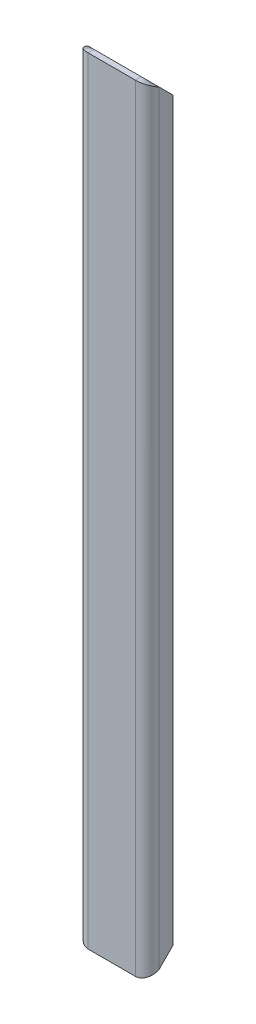
ISO-10303-21;
HEADER;
FILE_DESCRIPTION(('STEP AP214'),'2;1');
FILE_NAME('part.step','',(''),(''),'','','');
FILE_SCHEMA(('AUTOMOTIVE_DESIGN { 1 0 10303 214 1 1 1 1 }'));
ENDSEC;
DATA;
#1=APPLICATION_CONTEXT('core data for automotive mechanical design processes');
#2=APPLICATION_PROTOCOL_DEFINITION('international standard','automotive_design',2000,#1);
#3=PRODUCT_CONTEXT('',#1,'mechanical');
#4=PRODUCT('Part','Part','',(#3));
#5=PRODUCT_RELATED_PRODUCT_CATEGORY('part','',(#4));
#6=PRODUCT_DEFINITION_FORMATION('','',#4);
#7=PRODUCT_DEFINITION_CONTEXT('part definition',#1,'design');
#8=PRODUCT_DEFINITION('design','',#6,#7);
#9=PRODUCT_DEFINITION_SHAPE('','',#8);
#10=(LENGTH_UNIT() NAMED_UNIT(*) SI_UNIT(.MILLI.,.METRE.));
#11=(NAMED_UNIT(*) PLANE_ANGLE_UNIT() SI_UNIT($,.RADIAN.));
#12=(NAMED_UNIT(*) SI_UNIT($,.STERADIAN.) SOLID_ANGLE_UNIT());
#13=UNCERTAINTY_MEASURE_WITH_UNIT(LENGTH_MEASURE(1.E-05),#10,'distance_accuracy_value','');
#14=(GEOMETRIC_REPRESENTATION_CONTEXT(3) GLOBAL_UNCERTAINTY_ASSIGNED_CONTEXT((#13)) GLOBAL_UNIT_ASSIGNED_CONTEXT((#10,
#11,#12)) REPRESENTATION_CONTEXT('',''));
#15=CARTESIAN_POINT('',(0.,0.,0.));
#16=DIRECTION('',(0.,0.,1.));
#17=DIRECTION('',(1.,0.,0.));
#18=AXIS2_PLACEMENT_3D('',#15,#16,#17);
#19=CARTESIAN_POINT('',(18.,400.,0.));
#20=DIRECTION('',(-1.,0.,0.));
#21=DIRECTION('',(0.,0.,1.));
#22=AXIS2_PLACEMENT_3D('',#19,#20,#21);
#23=PLANE('',#22);
#24=DIRECTION('',(0.,-0.707106781186544,-0.707106781186551));
#25=VECTOR('',#24,1.);
#26=CARTESIAN_POINT('',(18.,400.,2.99999999999999));
#27=LINE('',#26,#25);
#28=CARTESIAN_POINT('',(18.,394.,-3.00000000000001));
#29=VERTEX_POINT('',#28);
#30=CARTESIAN_POINT('',(18.,387.,-10.));
#31=VERTEX_POINT('',#30);
#32=EDGE_CURVE('E246',#29,#31,#27,.T.);
#33=ORIENTED_EDGE('',*,*,#32,.F.);
#34=DIRECTION('',(0.,-1.,0.));
#35=VECTOR('',#34,1.);
#36=CARTESIAN_POINT('',(18.,400.,-3.00000000000001));
#37=LINE('',#36,#35);
#38=CARTESIAN_POINT('',(18.,5.99999999999989,-3.00000000000001));
#39=VERTEX_POINT('',#38);
#40=EDGE_CURVE('E61',#29,#39,#37,.T.);
#41=ORIENTED_EDGE('',*,*,#40,.T.);
#42=DIRECTION('',(0.,0.707106781186544,-0.707106781186551));
#43=VECTOR('',#42,1.);
#44=CARTESIAN_POINT('',(18.,201.499999999998,-198.5));
#45=LINE('',#44,#43);
#46=CARTESIAN_POINT('',(18.,12.9999999999998,-9.99999999999998));
#47=VERTEX_POINT('',#46);
#48=EDGE_CURVE('E198',#39,#47,#45,.T.);
#49=ORIENTED_EDGE('',*,*,#48,.T.);
#50=DIRECTION('',(0.,-1.,0.));
#51=VECTOR('',#50,1.);
#52=CARTESIAN_POINT('',(18.,400.,-10.));
#53=LINE('',#52,#51);
#54=EDGE_CURVE('E11',#31,#47,#53,.T.);
#55=ORIENTED_EDGE('',*,*,#54,.F.);
#56=EDGE_LOOP('',(#33,#41,#49,#55));
#57=FACE_BOUND('',#56,.T.);
#58=ADVANCED_FACE('F39',(#57),#23,.F.);
#59=CARTESIAN_POINT('',(15.,400.,-10.));
#60=DIRECTION('',(0.,0.,-1.));
#61=DIRECTION('',(-1.,0.,0.));
#62=AXIS2_PLACEMENT_3D('',#59,#60,#61);
#63=PLANE('',#62);
#64=DIRECTION('',(0.,-1.,0.));
#65=VECTOR('',#64,1.);
#66=CARTESIAN_POINT('',(15.,400.,-10.));
#67=LINE('',#66,#65);
#68=CARTESIAN_POINT('',(15.,387.,-10.));
#69=VERTEX_POINT('',#68);
#70=CARTESIAN_POINT('',(15.,12.9999999999998,-9.99999999999998));
#71=VERTEX_POINT('',#70);
#72=EDGE_CURVE('E46',#69,#71,#67,.T.);
#73=ORIENTED_EDGE('',*,*,#72,.F.);
#74=DIRECTION('',(1.,0.,0.));
#75=VECTOR('',#74,1.);
#76=CARTESIAN_POINT('',(18.,387.,-10.));
#77=LINE('',#76,#75);
#78=EDGE_CURVE('E249',#31,#69,#77,.F.);
#79=ORIENTED_EDGE('',*,*,#78,.F.);
#80=ORIENTED_EDGE('',*,*,#54,.T.);
#81=DIRECTION('',(-1.,0.,0.));
#82=VECTOR('',#81,1.);
#83=CARTESIAN_POINT('',(15.,12.9999999999998,-9.99999999999998));
#84=LINE('',#83,#82);
#85=EDGE_CURVE('E196',#71,#47,#84,.F.);
#86=ORIENTED_EDGE('',*,*,#85,.F.);
#87=EDGE_LOOP('',(#73,#79,#80,#86));
#88=FACE_BOUND('',#87,.T.);
#89=ADVANCED_FACE('F201',(#88),#63,.T.);
#90=CARTESIAN_POINT('',(15.,400.,0.));
#91=DIRECTION('',(-1.,0.,0.));
#92=DIRECTION('',(0.,0.,1.));
#93=AXIS2_PLACEMENT_3D('',#90,#91,#92);
#94=PLANE('',#93);
#95=DIRECTION('',(0.,-1.,0.));
#96=VECTOR('',#95,1.);
#97=CARTESIAN_POINT('',(15.,400.,-3.00000000000001));
#98=LINE('',#97,#96);
#99=CARTESIAN_POINT('',(15.,394.,-3.00000000000001));
#100=VERTEX_POINT('',#99);
#101=CARTESIAN_POINT('',(15.,5.99999999999989,-3.00000000000001));
#102=VERTEX_POINT('',#101);
#103=EDGE_CURVE('E178',#100,#102,#98,.T.);
#104=ORIENTED_EDGE('',*,*,#103,.F.);
#105=DIRECTION('',(0.,-0.707106781186544,-0.707106781186551));
#106=VECTOR('',#105,1.);
#107=CARTESIAN_POINT('',(15.,400.,2.99999999999999));
#108=LINE('',#107,#106);
#109=EDGE_CURVE('E187',#100,#69,#108,.T.);
#110=ORIENTED_EDGE('',*,*,#109,.T.);
#111=ORIENTED_EDGE('',*,*,#72,.T.);
#112=DIRECTION('',(0.,0.707106781186544,-0.707106781186551));
#113=VECTOR('',#112,1.);
#114=CARTESIAN_POINT('',(15.,201.499999999998,-198.5));
#115=LINE('',#114,#113);
#116=EDGE_CURVE('E186',#102,#71,#115,.T.);
#117=ORIENTED_EDGE('',*,*,#116,.F.);
#118=EDGE_LOOP('',(#104,#110,#111,#117));
#119=FACE_BOUND('',#118,.T.);
#120=ADVANCED_FACE('F185',(#119),#94,.T.);
#121=CARTESIAN_POINT('',(12.,400.,-3.00000000000001));
#122=DIRECTION('',(0.,-1.,0.));
#123=DIRECTION('',(0.,0.,-1.));
#124=AXIS2_PLACEMENT_3D('',#121,#122,#123);
#125=CYLINDRICAL_SURFACE('',#124,3.);
#126=DIRECTION('',(0.,-1.,0.));
#127=VECTOR('',#126,1.);
#128=CARTESIAN_POINT('',(12.,400.,0.));
#129=LINE('',#128,#127);
#130=CARTESIAN_POINT('',(12.,397.,0.));
#131=VERTEX_POINT('',#130);
#132=CARTESIAN_POINT('',(12.,2.9999999999999,0.));
#133=VERTEX_POINT('',#132);
#134=EDGE_CURVE('E176',#131,#133,#129,.T.);
#135=ORIENTED_EDGE('',*,*,#134,.F.);
#136=CARTESIAN_POINT('',(12.,394.,-3.00000000000001));
#137=DIRECTION('',(0.,-0.707106781186551,0.707106781186544));
#138=DIRECTION('',(0.,-0.707106781186544,-0.707106781186551));
#139=AXIS2_PLACEMENT_3D('',#136,#137,#138);
#140=ELLIPSE('',#139,4.24264068711926,3.);
#141=EDGE_CURVE('E157',#100,#131,#140,.T.);
#142=ORIENTED_EDGE('',*,*,#141,.F.);
#143=ORIENTED_EDGE('',*,*,#103,.T.);
#144=CARTESIAN_POINT('',(12.,5.99999999999989,-3.00000000000001));
#145=DIRECTION('',(0.,0.707106781186551,0.707106781186544));
#146=DIRECTION('',(0.,-0.707106781186544,0.707106781186551));
#147=AXIS2_PLACEMENT_3D('',#144,#145,#146);
#148=ELLIPSE('',#147,4.24264068711926,3.);
#149=EDGE_CURVE('E225',#133,#102,#148,.T.);
#150=ORIENTED_EDGE('',*,*,#149,.F.);
#151=EDGE_LOOP('',(#135,#142,#143,#150));
#152=FACE_BOUND('',#151,.T.);
#153=ADVANCED_FACE('F292',(#152),#125,.F.);
#154=CARTESIAN_POINT('',(-15.,400.,0.));
#155=DIRECTION('',(0.,0.,-1.));
#156=DIRECTION('',(-1.,0.,0.));
#157=AXIS2_PLACEMENT_3D('',#154,#155,#156);
#158=PLANE('',#157);
#159=DIRECTION('',(0.,-1.,0.));
#160=VECTOR('',#159,1.);
#161=CARTESIAN_POINT('',(-12.,400.,0.));
#162=LINE('',#161,#160);
#163=CARTESIAN_POINT('',(-12.,397.,0.));
#164=VERTEX_POINT('',#163);
#165=CARTESIAN_POINT('',(-12.,3.,0.));
#166=VERTEX_POINT('',#165);
#167=EDGE_CURVE('E174',#164,#166,#162,.T.);
#168=ORIENTED_EDGE('',*,*,#167,.F.);
#169=DIRECTION('',(-1.,0.,0.));
#170=VECTOR('',#169,1.);
#171=CARTESIAN_POINT('',(-15.,397.,0.));
#172=LINE('',#171,#170);
#173=EDGE_CURVE('E289',#131,#164,#172,.T.);
#174=ORIENTED_EDGE('',*,*,#173,.F.);
#175=ORIENTED_EDGE('',*,*,#134,.T.);
#176=DIRECTION('',(1.,0.,0.));
#177=VECTOR('',#176,1.);
#178=CARTESIAN_POINT('',(-14.9999999999999,2.99999999999989,0.));
#179=LINE('',#178,#177);
#180=EDGE_CURVE('E235',#166,#133,#179,.T.);
#181=ORIENTED_EDGE('',*,*,#180,.F.);
#182=EDGE_LOOP('',(#168,#174,#175,#181));
#183=FACE_BOUND('',#182,.T.);
#184=ADVANCED_FACE('F285',(#183),#158,.T.);
#185=CARTESIAN_POINT('',(-12.,400.,-3.));
#186=DIRECTION('',(0.,-1.,0.));
#187=DIRECTION('',(0.,0.,-1.));
#188=AXIS2_PLACEMENT_3D('',#185,#186,#187);
#189=CYLINDRICAL_SURFACE('',#188,3.);
#190=DIRECTION('',(0.,-1.,0.));
#191=VECTOR('',#190,1.);
#192=CARTESIAN_POINT('',(-15.,400.,-3.));
#193=LINE('',#192,#191);
#194=CARTESIAN_POINT('',(-15.,394.,-3.));
#195=VERTEX_POINT('',#194);
#196=CARTESIAN_POINT('',(-15.,5.99999999999989,-3.));
#197=VERTEX_POINT('',#196);
#198=EDGE_CURVE('E172',#195,#197,#193,.T.);
#199=ORIENTED_EDGE('',*,*,#198,.F.);
#200=CARTESIAN_POINT('',(-12.,394.,-3.));
#201=DIRECTION('',(0.,-0.707106781186551,0.707106781186544));
#202=DIRECTION('',(0.,-0.707106781186544,-0.707106781186551));
#203=AXIS2_PLACEMENT_3D('',#200,#201,#202);
#204=ELLIPSE('',#203,4.24264068711926,3.);
#205=EDGE_CURVE('E135',#164,#195,#204,.T.);
#206=ORIENTED_EDGE('',*,*,#205,.F.);
#207=ORIENTED_EDGE('',*,*,#167,.T.);
#208=CARTESIAN_POINT('',(-12.,5.99999999999989,-3.));
#209=DIRECTION('',(0.,0.707106781186551,0.707106781186544));
#210=DIRECTION('',(0.,-0.707106781186544,0.707106781186551));
#211=AXIS2_PLACEMENT_3D('',#208,#209,#210);
#212=ELLIPSE('',#211,4.24264068711926,3.);
#213=EDGE_CURVE('E224',#197,#166,#212,.T.);
#214=ORIENTED_EDGE('',*,*,#213,.F.);
#215=EDGE_LOOP('',(#199,#206,#207,#214));
#216=FACE_BOUND('',#215,.T.);
#217=ADVANCED_FACE('F280',(#216),#189,.F.);
#218=CARTESIAN_POINT('',(-15.,400.,0.));
#219=DIRECTION('',(1.,0.,0.));
#220=DIRECTION('',(0.,0.,-1.));
#221=AXIS2_PLACEMENT_3D('',#218,#219,#220);
#222=PLANE('',#221);
#223=DIRECTION('',(0.,-1.,0.));
#224=VECTOR('',#223,1.);
#225=CARTESIAN_POINT('',(-15.,400.,-20.));
#226=LINE('',#225,#224);
#227=CARTESIAN_POINT('',(-15.,377.,-20.));
#228=VERTEX_POINT('',#227);
#229=CARTESIAN_POINT('',(-15.,22.9999999999997,-20.));
#230=VERTEX_POINT('',#229);
#231=EDGE_CURVE('E165',#228,#230,#226,.T.);
#232=ORIENTED_EDGE('',*,*,#231,.F.);
#233=DIRECTION('',(0.,-0.707106781186544,-0.707106781186551));
#234=VECTOR('',#233,1.);
#235=CARTESIAN_POINT('',(-15.,400.,2.99999999999999));
#236=LINE('',#235,#234);
#237=EDGE_CURVE('E139',#195,#228,#236,.T.);
#238=ORIENTED_EDGE('',*,*,#237,.F.);
#239=ORIENTED_EDGE('',*,*,#198,.T.);
#240=DIRECTION('',(0.,-0.707106781186544,0.707106781186551));
#241=VECTOR('',#240,1.);
#242=CARTESIAN_POINT('',(-15.0000000000001,201.499999999998,-198.5));
#243=LINE('',#242,#241);
#244=EDGE_CURVE('E260',#230,#197,#243,.T.);
#245=ORIENTED_EDGE('',*,*,#244,.F.);
#246=EDGE_LOOP('',(#232,#238,#239,#245));
#247=FACE_BOUND('',#246,.T.);
#248=ADVANCED_FACE('F276',(#247),#222,.T.);
#249=CARTESIAN_POINT('',(-18.,400.,-20.));
#250=DIRECTION('',(0.,0.,-1.));
#251=DIRECTION('',(-1.,0.,0.));
#252=AXIS2_PLACEMENT_3D('',#249,#250,#251);
#253=PLANE('',#252);
#254=DIRECTION('',(0.,-1.,0.));
#255=VECTOR('',#254,1.);
#256=CARTESIAN_POINT('',(-18.,400.,-20.));
#257=LINE('',#256,#255);
#258=CARTESIAN_POINT('',(-18.,377.,-20.));
#259=VERTEX_POINT('',#258);
#260=CARTESIAN_POINT('',(-18.,22.9999999999997,-20.));
#261=VERTEX_POINT('',#260);
#262=EDGE_CURVE('E163',#259,#261,#257,.T.);
#263=ORIENTED_EDGE('',*,*,#262,.F.);
#264=DIRECTION('',(-1.,0.,0.));
#265=VECTOR('',#264,1.);
#266=CARTESIAN_POINT('',(-18.,377.,-20.));
#267=LINE('',#266,#265);
#268=EDGE_CURVE('E138',#259,#228,#267,.F.);
#269=ORIENTED_EDGE('',*,*,#268,.T.);
#270=ORIENTED_EDGE('',*,*,#231,.T.);
#271=DIRECTION('',(1.,0.,0.));
#272=VECTOR('',#271,1.);
#273=CARTESIAN_POINT('',(-15.,22.9999999999997,-20.));
#274=LINE('',#273,#272);
#275=EDGE_CURVE('E244',#230,#261,#274,.F.);
#276=ORIENTED_EDGE('',*,*,#275,.T.);
#277=EDGE_LOOP('',(#263,#269,#270,#276));
#278=FACE_BOUND('',#277,.T.);
#279=ADVANCED_FACE('F271',(#278),#253,.T.);
#280=CARTESIAN_POINT('',(-18.,400.,0.));
#281=DIRECTION('',(1.,0.,0.));
#282=DIRECTION('',(0.,0.,-1.));
#283=AXIS2_PLACEMENT_3D('',#280,#281,#282);
#284=PLANE('',#283);
#285=DIRECTION('',(0.,-0.707106781186544,-0.707106781186551));
#286=VECTOR('',#285,1.);
#287=CARTESIAN_POINT('',(-18.,400.,2.99999999999999));
#288=LINE('',#287,#286);
#289=CARTESIAN_POINT('',(-18.,394.,-3.));
#290=VERTEX_POINT('',#289);
#291=EDGE_CURVE('E142',#290,#259,#288,.T.);
#292=ORIENTED_EDGE('',*,*,#291,.T.);
#293=ORIENTED_EDGE('',*,*,#262,.T.);
#294=DIRECTION('',(0.,-0.707106781186544,0.707106781186551));
#295=VECTOR('',#294,1.);
#296=CARTESIAN_POINT('',(-18.0000000000001,201.499999999998,-198.5));
#297=LINE('',#296,#295);
#298=CARTESIAN_POINT('',(-18.,5.99999999999989,-3.));
#299=VERTEX_POINT('',#298);
#300=EDGE_CURVE('E162',#261,#299,#297,.T.);
#301=ORIENTED_EDGE('',*,*,#300,.T.);
#302=DIRECTION('',(0.,-1.,0.));
#303=VECTOR('',#302,1.);
#304=CARTESIAN_POINT('',(-18.,400.,-3.));
#305=LINE('',#304,#303);
#306=EDGE_CURVE('E154',#290,#299,#305,.T.);
#307=ORIENTED_EDGE('',*,*,#306,.F.);
#308=EDGE_LOOP('',(#292,#293,#301,#307));
#309=FACE_BOUND('',#308,.T.);
#310=ADVANCED_FACE('F160',(#309),#284,.F.);
#311=CARTESIAN_POINT('',(-12.,400.,-3.));
#312=DIRECTION('',(0.,-1.,0.));
#313=DIRECTION('',(0.,0.,-1.));
#314=AXIS2_PLACEMENT_3D('',#311,#312,#313);
#315=CYLINDRICAL_SURFACE('',#314,6.);
#316=CARTESIAN_POINT('',(-12.,394.,-3.));
#317=DIRECTION('',(0.,-0.894427190999919,0.447213595499952));
#318=DIRECTION('',(0.,-0.447213595499952,-0.894427190999919));
#319=AXIS2_PLACEMENT_3D('',#316,#317,#318);
#320=ELLIPSE('',#319,6.70820393249935,6.);
#321=CARTESIAN_POINT('',(-12.,397.,3.));
#322=VERTEX_POINT('',#321);
#323=EDGE_CURVE('E132',#322,#290,#320,.T.);
#324=ORIENTED_EDGE('',*,*,#323,.T.);
#325=ORIENTED_EDGE('',*,*,#306,.T.);
#326=CARTESIAN_POINT('',(-12.,5.99999999999989,-3.));
#327=DIRECTION('',(0.,0.894427190999917,0.447213595499956));
#328=DIRECTION('',(0.,-0.447213595499956,0.894427190999917));
#329=AXIS2_PLACEMENT_3D('',#326,#327,#328);
#330=ELLIPSE('',#329,6.70820393249936,6.);
#331=CARTESIAN_POINT('',(-12.,3.00000000000011,3.));
#332=VERTEX_POINT('',#331);
#333=EDGE_CURVE('E258',#299,#332,#330,.T.);
#334=ORIENTED_EDGE('',*,*,#333,.T.);
#335=DIRECTION('',(0.,-1.,0.));
#336=VECTOR('',#335,1.);
#337=CARTESIAN_POINT('',(-12.,400.,3.));
#338=LINE('',#337,#336);
#339=EDGE_CURVE('E156',#322,#332,#338,.T.);
#340=ORIENTED_EDGE('',*,*,#339,.F.);
#341=EDGE_LOOP('',(#324,#325,#334,#340));
#342=FACE_BOUND('',#341,.T.);
#343=ADVANCED_FACE('F152',(#342),#315,.T.);
#344=CARTESIAN_POINT('',(-15.,400.,3.));
#345=DIRECTION('',(0.,0.,-1.));
#346=DIRECTION('',(-1.,0.,0.));
#347=AXIS2_PLACEMENT_3D('',#344,#345,#346);
#348=PLANE('',#347);
#349=DIRECTION('',(-1.,0.,0.));
#350=VECTOR('',#349,1.);
#351=CARTESIAN_POINT('',(-15.,397.,3.));
#352=LINE('',#351,#350);
#353=CARTESIAN_POINT('',(12.,397.,2.99999999999999));
#354=VERTEX_POINT('',#353);
#355=EDGE_CURVE('E297',#354,#322,#352,.T.);
#356=ORIENTED_EDGE('',*,*,#355,.T.);
#357=ORIENTED_EDGE('',*,*,#339,.T.);
#358=DIRECTION('',(-1.,0.,0.));
#359=VECTOR('',#358,1.);
#360=CARTESIAN_POINT('',(-15.,3.00000000000011,3.));
#361=LINE('',#360,#359);
#362=CARTESIAN_POINT('',(12.,2.99999999999989,2.99999999999999));
#363=VERTEX_POINT('',#362);
#364=EDGE_CURVE('E232',#332,#363,#361,.F.);
#365=ORIENTED_EDGE('',*,*,#364,.T.);
#366=DIRECTION('',(0.,-1.,0.));
#367=VECTOR('',#366,1.);
#368=CARTESIAN_POINT('',(12.,400.,2.99999999999999));
#369=LINE('',#368,#367);
#370=EDGE_CURVE('E167',#354,#363,#369,.T.);
#371=ORIENTED_EDGE('',*,*,#370,.F.);
#372=EDGE_LOOP('',(#356,#357,#365,#371));
#373=FACE_BOUND('',#372,.T.);
#374=ADVANCED_FACE('F238',(#373),#348,.F.);
#375=CARTESIAN_POINT('',(12.,400.,-3.00000000000001));
#376=DIRECTION('',(0.,-1.,0.));
#377=DIRECTION('',(0.,0.,-1.));
#378=AXIS2_PLACEMENT_3D('',#375,#376,#377);
#379=CYLINDRICAL_SURFACE('',#378,6.);
#380=CARTESIAN_POINT('',(12.,394.,-3.00000000000001));
#381=DIRECTION('',(0.,-0.894427190999919,0.447213595499952));
#382=DIRECTION('',(0.,-0.447213595499952,-0.894427190999919));
#383=AXIS2_PLACEMENT_3D('',#380,#381,#382);
#384=ELLIPSE('',#383,6.70820393249935,6.);
#385=EDGE_CURVE('E214',#29,#354,#384,.T.);
#386=ORIENTED_EDGE('',*,*,#385,.T.);
#387=ORIENTED_EDGE('',*,*,#370,.T.);
#388=CARTESIAN_POINT('',(12.,5.99999999999989,-3.00000000000001));
#389=DIRECTION('',(0.,0.894427190999917,0.447213595499956));
#390=DIRECTION('',(0.,-0.447213595499956,0.894427190999917));
#391=AXIS2_PLACEMENT_3D('',#388,#389,#390);
#392=ELLIPSE('',#391,6.70820393249936,6.);
#393=EDGE_CURVE('E213',#363,#39,#392,.T.);
#394=ORIENTED_EDGE('',*,*,#393,.T.);
#395=ORIENTED_EDGE('',*,*,#40,.F.);
#396=EDGE_LOOP('',(#386,#387,#394,#395));
#397=FACE_BOUND('',#396,.T.);
#398=ADVANCED_FACE('F212',(#397),#379,.T.);
#399=CARTESIAN_POINT('',(15.,201.499999999998,-198.5));
#400=DIRECTION('',(0.,0.707106781186551,0.707106781186544));
#401=DIRECTION('',(0.,0.707106781186544,-0.707106781186551));
#402=AXIS2_PLACEMENT_3D('',#399,#400,#401);
#403=PLANE('',#402);
#404=ORIENTED_EDGE('',*,*,#116,.T.);
#405=ORIENTED_EDGE('',*,*,#85,.T.);
#406=ORIENTED_EDGE('',*,*,#48,.F.);
#407=DIRECTION('',(-1.,0.,0.));
#408=VECTOR('',#407,1.);
#409=CARTESIAN_POINT('',(15.,5.99999999999989,-3.00000000000001));
#410=LINE('',#409,#408);
#411=EDGE_CURVE('E197',#102,#39,#410,.F.);
#412=ORIENTED_EDGE('',*,*,#411,.F.);
#413=EDGE_LOOP('',(#404,#405,#406,#412));
#414=FACE_BOUND('',#413,.T.);
#415=ADVANCED_FACE('F194',(#414),#403,.F.);
#416=CARTESIAN_POINT('',(-14.9999999999999,2.99999999999989,0.));
#417=DIRECTION('',(0.,1.,0.));
#418=DIRECTION('',(1.,0.,0.));
#419=AXIS2_PLACEMENT_3D('',#416,#417,#418);
#420=PLANE('',#419);
#421=ORIENTED_EDGE('',*,*,#180,.T.);
#422=DIRECTION('',(0.,0.,-1.));
#423=VECTOR('',#422,1.);
#424=CARTESIAN_POINT('',(12.,2.9999999999999,0.));
#425=LINE('',#424,#423);
#426=EDGE_CURVE('E199',#133,#363,#425,.F.);
#427=ORIENTED_EDGE('',*,*,#426,.T.);
#428=ORIENTED_EDGE('',*,*,#364,.F.);
#429=DIRECTION('',(0.,0.,-1.));
#430=VECTOR('',#429,1.);
#431=CARTESIAN_POINT('',(-12.,3.,0.));
#432=LINE('',#431,#430);
#433=EDGE_CURVE('E236',#166,#332,#432,.F.);
#434=ORIENTED_EDGE('',*,*,#433,.F.);
#435=EDGE_LOOP('',(#421,#427,#428,#434));
#436=FACE_BOUND('',#435,.T.);
#437=ADVANCED_FACE('F230',(#436),#420,.F.);
#438=CARTESIAN_POINT('',(-15.0000000000001,201.499999999998,-198.5));
#439=DIRECTION('',(0.,0.707106781186551,0.707106781186544));
#440=DIRECTION('',(0.,-0.707106781186544,0.707106781186551));
#441=AXIS2_PLACEMENT_3D('',#438,#439,#440);
#442=PLANE('',#441);
#443=ORIENTED_EDGE('',*,*,#244,.T.);
#444=DIRECTION('',(1.,0.,0.));
#445=VECTOR('',#444,1.);
#446=CARTESIAN_POINT('',(-15.,5.99999999999989,-3.));
#447=LINE('',#446,#445);
#448=EDGE_CURVE('E241',#197,#299,#447,.F.);
#449=ORIENTED_EDGE('',*,*,#448,.T.);
#450=ORIENTED_EDGE('',*,*,#300,.F.);
#451=ORIENTED_EDGE('',*,*,#275,.F.);
#452=EDGE_LOOP('',(#443,#449,#450,#451));
#453=FACE_BOUND('',#452,.T.);
#454=ADVANCED_FACE('F274',(#453),#442,.F.);
#455=CARTESIAN_POINT('',(-12.,2.99999999999993,0.));
#456=CARTESIAN_POINT('',(-12.,2.99999999999992,1.));
#457=CARTESIAN_POINT('',(-12.,2.99999999999992,2.));
#458=CARTESIAN_POINT('',(-12.,2.99999999999991,3.));
#459=CARTESIAN_POINT('',(-6.,2.99999999999993,0.));
#460=CARTESIAN_POINT('',(-4.,2.99999999999992,1.));
#461=CARTESIAN_POINT('',(-2.,2.99999999999992,2.));
#462=CARTESIAN_POINT('',(0.,2.99999999999991,3.));
#463=CARTESIAN_POINT('',(-6.,8.99999999999986,-6.));
#464=CARTESIAN_POINT('',(-4.,8.99999999999987,-7.));
#465=CARTESIAN_POINT('',(-2.,8.99999999999988,-8.));
#466=CARTESIAN_POINT('',(0.,8.99999999999988,-9.));
#467=CARTESIAN_POINT('',(-12.,8.99999999999986,-6.));
#468=CARTESIAN_POINT('',(-12.,8.99999999999987,-7.));
#469=CARTESIAN_POINT('',(-12.,8.99999999999987,-8.));
#470=CARTESIAN_POINT('',(-12.,8.99999999999988,-9.));
#471=CARTESIAN_POINT('',(-18.,8.99999999999986,-6.));
#472=CARTESIAN_POINT('',(-20.,8.99999999999987,-7.));
#473=CARTESIAN_POINT('',(-22.,8.99999999999988,-8.00000000000001));
#474=CARTESIAN_POINT('',(-24.,8.99999999999988,-9.));
#475=CARTESIAN_POINT('',(-18.,2.99999999999993,0.));
#476=CARTESIAN_POINT('',(-20.,2.99999999999992,1.));
#477=CARTESIAN_POINT('',(-22.,2.99999999999992,2.));
#478=CARTESIAN_POINT('',(-24.,2.99999999999991,3.));
#479=CARTESIAN_POINT('',(-12.,2.99999999999993,0.));
#480=CARTESIAN_POINT('',(-12.,2.99999999999992,1.));
#481=CARTESIAN_POINT('',(-12.,2.99999999999992,2.));
#482=CARTESIAN_POINT('',(-12.,2.99999999999991,3.));
#483=(BOUNDED_SURFACE() B_SPLINE_SURFACE(3,3,((#455,#456,#457,#458),(#459,#460,#461,#462),(#463,
#464,#465,#466),(#467,#468,#469,#470),(#471,#472,#473,#474),(#475,#476,#477,#478),(#479,#480,
#481,#482)),.UNSPECIFIED.,.T.,.F.,.F.) B_SPLINE_SURFACE_WITH_KNOTS((4,3,4),(4,4),(0.,0.5,1.),
(0.,1.),.UNSPECIFIED.) GEOMETRIC_REPRESENTATION_ITEM() RATIONAL_B_SPLINE_SURFACE(((1.,1.,1.,1.),
(0.333333333333333,0.333333333333333,0.333333333333333,0.333333333333333),(0.333333333333333,
0.333333333333333,0.333333333333333,0.333333333333333),(1.,1.,1.,1.),(0.333333333333333,
0.333333333333333,0.333333333333333,0.333333333333333),(0.333333333333333,0.333333333333333,
0.333333333333333,0.333333333333333),(1.,1.,1.,1.))) REPRESENTATION_ITEM('') SURFACE());
#484=ORIENTED_EDGE('',*,*,#213,.T.);
#485=ORIENTED_EDGE('',*,*,#433,.T.);
#486=ORIENTED_EDGE('',*,*,#333,.F.);
#487=ORIENTED_EDGE('',*,*,#448,.F.);
#488=EDGE_LOOP('',(#484,#485,#486,#487));
#489=FACE_BOUND('',#488,.T.);
#490=ADVANCED_FACE('F283',(#489),#483,.T.);
#491=CARTESIAN_POINT('',(12.,2.99999999999993,0.));
#492=CARTESIAN_POINT('',(12.,2.99999999999992,0.999999999999995));
#493=CARTESIAN_POINT('',(12.,2.99999999999992,1.99999999999999));
#494=CARTESIAN_POINT('',(12.,2.99999999999991,2.99999999999999));
#495=CARTESIAN_POINT('',(18.,2.99999999999993,0.));
#496=CARTESIAN_POINT('',(20.,2.99999999999992,0.999999999999995));
#497=CARTESIAN_POINT('',(22.,2.99999999999992,2.));
#498=CARTESIAN_POINT('',(24.,2.99999999999991,3.));
#499=CARTESIAN_POINT('',(18.,8.99999999999986,-6.));
#500=CARTESIAN_POINT('',(20.,8.99999999999987,-7.00000000000001));
#501=CARTESIAN_POINT('',(22.,8.99999999999988,-8.00000000000001));
#502=CARTESIAN_POINT('',(24.,8.99999999999988,-9.));
#503=CARTESIAN_POINT('',(12.,8.99999999999986,-6.00000000000001));
#504=CARTESIAN_POINT('',(12.,8.99999999999987,-7.));
#505=CARTESIAN_POINT('',(12.,8.99999999999987,-8.));
#506=CARTESIAN_POINT('',(12.,8.99999999999988,-9.00000000000001));
#507=CARTESIAN_POINT('',(6.,8.99999999999986,-6.00000000000001));
#508=CARTESIAN_POINT('',(4.,8.99999999999987,-7.00000000000001));
#509=CARTESIAN_POINT('',(2.,8.99999999999988,-8.00000000000001));
#510=CARTESIAN_POINT('',(0.,8.99999999999988,-9.00000000000001));
#511=CARTESIAN_POINT('',(6.,2.99999999999993,0.));
#512=CARTESIAN_POINT('',(4.,2.99999999999992,0.999999999999995));
#513=CARTESIAN_POINT('',(2.,2.99999999999992,2.));
#514=CARTESIAN_POINT('',(0.,2.99999999999991,3.));
#515=CARTESIAN_POINT('',(12.,2.99999999999993,0.));
#516=CARTESIAN_POINT('',(12.,2.99999999999992,0.999999999999995));
#517=CARTESIAN_POINT('',(12.,2.99999999999992,1.99999999999999));
#518=CARTESIAN_POINT('',(12.,2.99999999999991,2.99999999999999));
#519=(BOUNDED_SURFACE() B_SPLINE_SURFACE(3,3,((#491,#492,#493,#494),(#495,#496,#497,#498),(#499,
#500,#501,#502),(#503,#504,#505,#506),(#507,#508,#509,#510),(#511,#512,#513,#514),(#515,#516,
#517,#518)),.UNSPECIFIED.,.T.,.F.,.F.) B_SPLINE_SURFACE_WITH_KNOTS((4,3,4),(4,4),(0.,0.5,1.),
(0.,1.),.UNSPECIFIED.) GEOMETRIC_REPRESENTATION_ITEM() RATIONAL_B_SPLINE_SURFACE(((1.,1.,1.,1.),
(0.333333333333333,0.333333333333333,0.333333333333333,0.333333333333333),(0.333333333333333,
0.333333333333333,0.333333333333333,0.333333333333333),(1.,1.,1.,1.),(0.333333333333333,
0.333333333333333,0.333333333333333,0.333333333333333),(0.333333333333333,0.333333333333333,
0.333333333333333,0.333333333333333),(1.,1.,1.,1.))) REPRESENTATION_ITEM('') SURFACE());
#520=ORIENTED_EDGE('',*,*,#149,.T.);
#521=ORIENTED_EDGE('',*,*,#411,.T.);
#522=ORIENTED_EDGE('',*,*,#393,.F.);
#523=ORIENTED_EDGE('',*,*,#426,.F.);
#524=EDGE_LOOP('',(#520,#521,#522,#523));
#525=FACE_BOUND('',#524,.T.);
#526=ADVANCED_FACE('F222',(#525),#519,.T.);
#527=CARTESIAN_POINT('',(18.,400.,2.99999999999999));
#528=DIRECTION('',(0.,0.707106781186551,-0.707106781186544));
#529=DIRECTION('',(0.,-0.707106781186544,-0.707106781186551));
#530=AXIS2_PLACEMENT_3D('',#527,#528,#529);
#531=PLANE('',#530);
#532=DIRECTION('',(1.,0.,0.));
#533=VECTOR('',#532,1.);
#534=CARTESIAN_POINT('',(18.,394.,-3.00000000000001));
#535=LINE('',#534,#533);
#536=EDGE_CURVE('E253',#29,#100,#535,.F.);
#537=ORIENTED_EDGE('',*,*,#536,.F.);
#538=ORIENTED_EDGE('',*,*,#32,.T.);
#539=ORIENTED_EDGE('',*,*,#78,.T.);
#540=ORIENTED_EDGE('',*,*,#109,.F.);
#541=EDGE_LOOP('',(#537,#538,#539,#540));
#542=FACE_BOUND('',#541,.T.);
#543=ADVANCED_FACE('F312',(#542),#531,.T.);
#544=CARTESIAN_POINT('',(-18.,400.,2.99999999999999));
#545=DIRECTION('',(0.,-0.707106781186551,0.707106781186544));
#546=DIRECTION('',(0.,-0.707106781186544,-0.707106781186551));
#547=AXIS2_PLACEMENT_3D('',#544,#545,#546);
#548=PLANE('',#547);
#549=ORIENTED_EDGE('',*,*,#268,.F.);
#550=ORIENTED_EDGE('',*,*,#291,.F.);
#551=DIRECTION('',(-1.,0.,0.));
#552=VECTOR('',#551,1.);
#553=CARTESIAN_POINT('',(-18.,394.,-3.));
#554=LINE('',#553,#552);
#555=EDGE_CURVE('E128',#290,#195,#554,.F.);
#556=ORIENTED_EDGE('',*,*,#555,.T.);
#557=ORIENTED_EDGE('',*,*,#237,.T.);
#558=EDGE_LOOP('',(#549,#550,#556,#557));
#559=FACE_BOUND('',#558,.T.);
#560=ADVANCED_FACE('F143',(#559),#548,.F.);
#561=CARTESIAN_POINT('',(-15.,397.,0.));
#562=DIRECTION('',(0.,-1.,0.));
#563=DIRECTION('',(-1.,0.,0.));
#564=AXIS2_PLACEMENT_3D('',#561,#562,#563);
#565=PLANE('',#564);
#566=ORIENTED_EDGE('',*,*,#173,.T.);
#567=DIRECTION('',(0.,0.,-1.));
#568=VECTOR('',#567,1.);
#569=CARTESIAN_POINT('',(-12.,397.,0.));
#570=LINE('',#569,#568);
#571=EDGE_CURVE('E148',#164,#322,#570,.F.);
#572=ORIENTED_EDGE('',*,*,#571,.T.);
#573=ORIENTED_EDGE('',*,*,#355,.F.);
#574=DIRECTION('',(0.,0.,-1.));
#575=VECTOR('',#574,1.);
#576=CARTESIAN_POINT('',(12.,397.,0.));
#577=LINE('',#576,#575);
#578=EDGE_CURVE('E53',#131,#354,#577,.F.);
#579=ORIENTED_EDGE('',*,*,#578,.F.);
#580=EDGE_LOOP('',(#566,#572,#573,#579));
#581=FACE_BOUND('',#580,.T.);
#582=ADVANCED_FACE('F303',(#581),#565,.F.);
#583=CARTESIAN_POINT('',(12.,391.,-6.00000000000001));
#584=CARTESIAN_POINT('',(12.,391.,-7.));
#585=CARTESIAN_POINT('',(12.,391.,-8.));
#586=CARTESIAN_POINT('',(12.,391.,-9.00000000000001));
#587=CARTESIAN_POINT('',(18.,391.,-6.00000000000001));
#588=CARTESIAN_POINT('',(20.,391.,-7.00000000000001));
#589=CARTESIAN_POINT('',(22.,391.,-8.00000000000001));
#590=CARTESIAN_POINT('',(24.,391.,-9.00000000000001));
#591=CARTESIAN_POINT('',(18.,397.,0.));
#592=CARTESIAN_POINT('',(20.,397.,0.999999999999994));
#593=CARTESIAN_POINT('',(22.,397.,1.99999999999999));
#594=CARTESIAN_POINT('',(24.,397.,2.99999999999999));
#595=CARTESIAN_POINT('',(12.,397.,0.));
#596=CARTESIAN_POINT('',(12.,397.,0.999999999999995));
#597=CARTESIAN_POINT('',(12.,397.,1.99999999999999));
#598=CARTESIAN_POINT('',(12.,397.,2.99999999999999));
#599=CARTESIAN_POINT('',(6.,397.,0.));
#600=CARTESIAN_POINT('',(4.,397.,0.999999999999996));
#601=CARTESIAN_POINT('',(2.,397.,2.));
#602=CARTESIAN_POINT('',(0.,397.,3.));
#603=CARTESIAN_POINT('',(6.,391.,-6.00000000000001));
#604=CARTESIAN_POINT('',(4.,391.,-7.00000000000001));
#605=CARTESIAN_POINT('',(2.,391.,-8.00000000000001));
#606=CARTESIAN_POINT('',(0.,391.,-9.00000000000001));
#607=CARTESIAN_POINT('',(12.,391.,-6.00000000000001));
#608=CARTESIAN_POINT('',(12.,391.,-7.));
#609=CARTESIAN_POINT('',(12.,391.,-8.));
#610=CARTESIAN_POINT('',(12.,391.,-9.00000000000001));
#611=(BOUNDED_SURFACE() B_SPLINE_SURFACE(3,3,((#583,#584,#585,#586),(#587,#588,#589,#590),(#591,
#592,#593,#594),(#595,#596,#597,#598),(#599,#600,#601,#602),(#603,#604,#605,#606),(#607,#608,
#609,#610)),.UNSPECIFIED.,.T.,.F.,.F.) B_SPLINE_SURFACE_WITH_KNOTS((4,3,4),(4,4),(0.,0.5,1.),
(0.,1.),.UNSPECIFIED.) GEOMETRIC_REPRESENTATION_ITEM() RATIONAL_B_SPLINE_SURFACE(((1.,1.,1.,1.),
(0.333333333333333,0.333333333333333,0.333333333333333,0.333333333333333),(0.333333333333333,
0.333333333333333,0.333333333333333,0.333333333333333),(1.,1.,1.,1.),(0.333333333333333,
0.333333333333333,0.333333333333333,0.333333333333333),(0.333333333333333,0.333333333333333,
0.333333333333333,0.333333333333333),(1.,1.,1.,1.))) REPRESENTATION_ITEM('') SURFACE());
#612=ORIENTED_EDGE('',*,*,#141,.T.);
#613=ORIENTED_EDGE('',*,*,#578,.T.);
#614=ORIENTED_EDGE('',*,*,#385,.F.);
#615=ORIENTED_EDGE('',*,*,#536,.T.);
#616=EDGE_LOOP('',(#612,#613,#614,#615));
#617=FACE_BOUND('',#616,.T.);
#618=ADVANCED_FACE('F305',(#617),#611,.T.);
#619=CARTESIAN_POINT('',(-12.,391.,-6.));
#620=CARTESIAN_POINT('',(-12.,391.,-7.));
#621=CARTESIAN_POINT('',(-12.,391.,-8.));
#622=CARTESIAN_POINT('',(-12.,391.,-9.));
#623=CARTESIAN_POINT('',(-6.,391.,-6.));
#624=CARTESIAN_POINT('',(-4.,391.,-7.));
#625=CARTESIAN_POINT('',(-2.,391.,-8.));
#626=CARTESIAN_POINT('',(0.,391.,-9.));
#627=CARTESIAN_POINT('',(-6.,397.,0.));
#628=CARTESIAN_POINT('',(-4.,397.,0.999999999999999));
#629=CARTESIAN_POINT('',(-2.,397.,2.));
#630=CARTESIAN_POINT('',(0.,397.,3.));
#631=CARTESIAN_POINT('',(-12.,397.,0.));
#632=CARTESIAN_POINT('',(-12.,397.,1.));
#633=CARTESIAN_POINT('',(-12.,397.,2.));
#634=CARTESIAN_POINT('',(-12.,397.,3.));
#635=CARTESIAN_POINT('',(-18.,397.,0.));
#636=CARTESIAN_POINT('',(-20.,397.,1.));
#637=CARTESIAN_POINT('',(-22.,397.,2.));
#638=CARTESIAN_POINT('',(-24.,397.,3.));
#639=CARTESIAN_POINT('',(-18.,391.,-6.));
#640=CARTESIAN_POINT('',(-20.,391.,-7.));
#641=CARTESIAN_POINT('',(-22.,391.,-8.));
#642=CARTESIAN_POINT('',(-24.,391.,-9.));
#643=CARTESIAN_POINT('',(-12.,391.,-6.));
#644=CARTESIAN_POINT('',(-12.,391.,-7.));
#645=CARTESIAN_POINT('',(-12.,391.,-8.));
#646=CARTESIAN_POINT('',(-12.,391.,-9.));
#647=(BOUNDED_SURFACE() B_SPLINE_SURFACE(3,3,((#619,#620,#621,#622),(#623,#624,#625,#626),(#627,
#628,#629,#630),(#631,#632,#633,#634),(#635,#636,#637,#638),(#639,#640,#641,#642),(#643,#644,
#645,#646)),.UNSPECIFIED.,.T.,.F.,.F.) B_SPLINE_SURFACE_WITH_KNOTS((4,3,4),(4,4),(0.,0.5,1.),
(0.,1.),.UNSPECIFIED.) GEOMETRIC_REPRESENTATION_ITEM() RATIONAL_B_SPLINE_SURFACE(((1.,1.,1.,1.),
(0.333333333333333,0.333333333333333,0.333333333333333,0.333333333333333),(0.333333333333333,
0.333333333333333,0.333333333333333,0.333333333333333),(1.,1.,1.,1.),(0.333333333333333,
0.333333333333333,0.333333333333333,0.333333333333333),(0.333333333333333,0.333333333333333,
0.333333333333333,0.333333333333333),(1.,1.,1.,1.))) REPRESENTATION_ITEM('') SURFACE());
#648=ORIENTED_EDGE('',*,*,#205,.T.);
#649=ORIENTED_EDGE('',*,*,#555,.F.);
#650=ORIENTED_EDGE('',*,*,#323,.F.);
#651=ORIENTED_EDGE('',*,*,#571,.F.);
#652=EDGE_LOOP('',(#648,#649,#650,#651));
#653=FACE_BOUND('',#652,.T.);
#654=ADVANCED_FACE('F130',(#653),#647,.T.);
#655=CLOSED_SHELL('',(#58,#89,#120,#153,#184,#217,#248,#279,#310,#343,#374,#398,#415,#437,#454,
#490,#526,#543,#560,#582,#618,#654));
#656=MANIFOLD_SOLID_BREP('B2',#655);
#657=ADVANCED_BREP_SHAPE_REPRESENTATION('',(#18,#656),#14);
#658=SHAPE_DEFINITION_REPRESENTATION(#9,#657);
ENDSEC;
END-ISO-10303-21;
